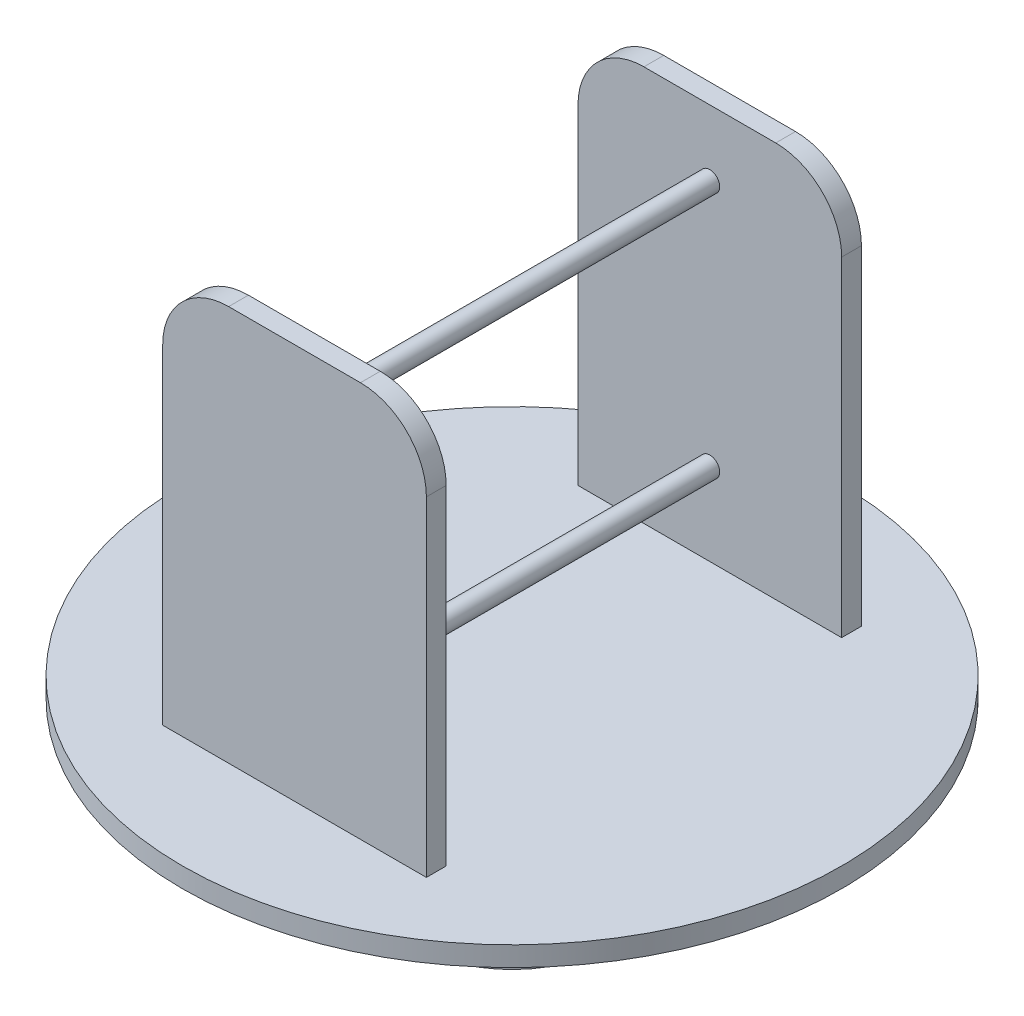
ISO-10303-21;
HEADER;
FILE_DESCRIPTION(('STEP AP214'),'2;1');
FILE_NAME('part.step','',(''),(''),'','','');
FILE_SCHEMA(('AUTOMOTIVE_DESIGN { 1 0 10303 214 1 1 1 1 }'));
ENDSEC;
DATA;
#1=APPLICATION_CONTEXT('core data for automotive mechanical design processes');
#2=APPLICATION_PROTOCOL_DEFINITION('international standard','automotive_design',2000,#1);
#3=PRODUCT_CONTEXT('',#1,'mechanical');
#4=PRODUCT('Part','Part','',(#3));
#5=PRODUCT_RELATED_PRODUCT_CATEGORY('part','',(#4));
#6=PRODUCT_DEFINITION_FORMATION('','',#4);
#7=PRODUCT_DEFINITION_CONTEXT('part definition',#1,'design');
#8=PRODUCT_DEFINITION('design','',#6,#7);
#9=PRODUCT_DEFINITION_SHAPE('','',#8);
#10=(LENGTH_UNIT() NAMED_UNIT(*) SI_UNIT(.MILLI.,.METRE.));
#11=(NAMED_UNIT(*) PLANE_ANGLE_UNIT() SI_UNIT($,.RADIAN.));
#12=(NAMED_UNIT(*) SI_UNIT($,.STERADIAN.) SOLID_ANGLE_UNIT());
#13=UNCERTAINTY_MEASURE_WITH_UNIT(LENGTH_MEASURE(1.E-05),#10,'distance_accuracy_value','');
#14=(GEOMETRIC_REPRESENTATION_CONTEXT(3) GLOBAL_UNCERTAINTY_ASSIGNED_CONTEXT((#13)) GLOBAL_UNIT_ASSIGNED_CONTEXT((#10,
#11,#12)) REPRESENTATION_CONTEXT('',''));
#15=CARTESIAN_POINT('',(0.,0.,0.));
#16=DIRECTION('',(0.,0.,1.));
#17=DIRECTION('',(1.,0.,0.));
#18=AXIS2_PLACEMENT_3D('',#15,#16,#17);
#19=CARTESIAN_POINT('',(0.,3.,0.));
#20=DIRECTION('',(0.,1.,0.));
#21=DIRECTION('',(0.,0.,1.));
#22=AXIS2_PLACEMENT_3D('',#19,#20,#21);
#23=PLANE('',#22);
#24=CARTESIAN_POINT('',(0.,3.,0.));
#25=DIRECTION('',(0.,1.,0.));
#26=DIRECTION('',(0.,0.,1.));
#27=AXIS2_PLACEMENT_3D('',#24,#25,#26);
#28=CIRCLE('',#27,50.);
#29=CARTESIAN_POINT('',(0.,3.,50.));
#30=VERTEX_POINT('',#29);
#31=EDGE_CURVE('E191',#30,#30,#28,.T.);
#32=ORIENTED_EDGE('',*,*,#31,.T.);
#33=EDGE_LOOP('',(#32));
#34=FACE_BOUND('',#33,.T.);
#35=DIRECTION('',(1.,0.,0.));
#36=VECTOR('',#35,1.);
#37=CARTESIAN_POINT('',(-20.,3.,33.));
#38=LINE('',#37,#36);
#39=CARTESIAN_POINT('',(-20.,3.,33.));
#40=VERTEX_POINT('',#39);
#41=CARTESIAN_POINT('',(20.,3.,33.));
#42=VERTEX_POINT('',#41);
#43=EDGE_CURVE('E168',#40,#42,#38,.T.);
#44=ORIENTED_EDGE('',*,*,#43,.F.);
#45=DIRECTION('',(0.,0.,1.));
#46=VECTOR('',#45,1.);
#47=CARTESIAN_POINT('',(-20.,3.,33.));
#48=LINE('',#47,#46);
#49=CARTESIAN_POINT('',(-20.,3.,30.));
#50=VERTEX_POINT('',#49);
#51=EDGE_CURVE('E132',#50,#40,#48,.T.);
#52=ORIENTED_EDGE('',*,*,#51,.F.);
#53=DIRECTION('',(-1.,0.,0.));
#54=VECTOR('',#53,1.);
#55=CARTESIAN_POINT('',(-20.,3.,30.));
#56=LINE('',#55,#54);
#57=CARTESIAN_POINT('',(20.,3.,30.));
#58=VERTEX_POINT('',#57);
#59=EDGE_CURVE('E162',#58,#50,#56,.T.);
#60=ORIENTED_EDGE('',*,*,#59,.F.);
#61=DIRECTION('',(0.,0.,-1.));
#62=VECTOR('',#61,1.);
#63=CARTESIAN_POINT('',(20.,3.,33.));
#64=LINE('',#63,#62);
#65=EDGE_CURVE('E171',#42,#58,#64,.T.);
#66=ORIENTED_EDGE('',*,*,#65,.F.);
#67=EDGE_LOOP('',(#44,#52,#60,#66));
#68=FACE_BOUND('',#67,.T.);
#69=DIRECTION('',(1.,0.,0.));
#70=VECTOR('',#69,1.);
#71=CARTESIAN_POINT('',(-20.,3.,-30.));
#72=LINE('',#71,#70);
#73=CARTESIAN_POINT('',(-20.,3.,-30.));
#74=VERTEX_POINT('',#73);
#75=CARTESIAN_POINT('',(20.,3.,-30.));
#76=VERTEX_POINT('',#75);
#77=EDGE_CURVE('E129',#74,#76,#72,.T.);
#78=ORIENTED_EDGE('',*,*,#77,.F.);
#79=DIRECTION('',(0.,0.,1.));
#80=VECTOR('',#79,1.);
#81=CARTESIAN_POINT('',(-20.,3.,-30.));
#82=LINE('',#81,#80);
#83=CARTESIAN_POINT('',(-20.,3.,-33.));
#84=VERTEX_POINT('',#83);
#85=EDGE_CURVE('E136',#84,#74,#82,.T.);
#86=ORIENTED_EDGE('',*,*,#85,.F.);
#87=DIRECTION('',(-1.,0.,0.));
#88=VECTOR('',#87,1.);
#89=CARTESIAN_POINT('',(-20.,3.,-33.));
#90=LINE('',#89,#88);
#91=CARTESIAN_POINT('',(20.,3.,-33.));
#92=VERTEX_POINT('',#91);
#93=EDGE_CURVE('E147',#92,#84,#90,.T.);
#94=ORIENTED_EDGE('',*,*,#93,.F.);
#95=DIRECTION('',(0.,0.,-1.));
#96=VECTOR('',#95,1.);
#97=CARTESIAN_POINT('',(20.,3.,-30.));
#98=LINE('',#97,#96);
#99=EDGE_CURVE('E145',#76,#92,#98,.T.);
#100=ORIENTED_EDGE('',*,*,#99,.F.);
#101=EDGE_LOOP('',(#78,#86,#94,#100));
#102=FACE_BOUND('',#101,.T.);
#103=ADVANCED_FACE('F35',(#34,#68,#102),#23,.T.);
#104=CARTESIAN_POINT('',(0.,3.,0.));
#105=DIRECTION('',(0.,-1.,0.));
#106=DIRECTION('',(0.,0.,-1.));
#107=AXIS2_PLACEMENT_3D('',#104,#105,#106);
#108=CYLINDRICAL_SURFACE('',#107,50.);
#109=ORIENTED_EDGE('',*,*,#31,.F.);
#110=EDGE_LOOP('',(#109));
#111=FACE_BOUND('',#110,.T.);
#112=CARTESIAN_POINT('',(0.,0.,0.));
#113=DIRECTION('',(0.,1.,0.));
#114=DIRECTION('',(0.,0.,1.));
#115=AXIS2_PLACEMENT_3D('',#112,#113,#114);
#116=CIRCLE('',#115,50.);
#117=CARTESIAN_POINT('',(0.,0.,50.));
#118=VERTEX_POINT('',#117);
#119=EDGE_CURVE('E186',#118,#118,#116,.T.);
#120=ORIENTED_EDGE('',*,*,#119,.T.);
#121=EDGE_LOOP('',(#120));
#122=FACE_BOUND('',#121,.T.);
#123=ADVANCED_FACE('F310',(#111,#122),#108,.T.);
#124=CARTESIAN_POINT('',(0.,0.,0.));
#125=DIRECTION('',(0.,1.,0.));
#126=DIRECTION('',(0.,0.,1.));
#127=AXIS2_PLACEMENT_3D('',#124,#125,#126);
#128=PLANE('',#127);
#129=CARTESIAN_POINT('',(0.,0.,0.));
#130=DIRECTION('',(0.,-1.,0.));
#131=DIRECTION('',(0.,0.,-1.));
#132=AXIS2_PLACEMENT_3D('',#129,#130,#131);
#133=CIRCLE('',#132,15.);
#134=CARTESIAN_POINT('',(0.,0.,-15.));
#135=VERTEX_POINT('',#134);
#136=EDGE_CURVE('E187',#135,#135,#133,.T.);
#137=ORIENTED_EDGE('',*,*,#136,.F.);
#138=EDGE_LOOP('',(#137));
#139=FACE_BOUND('',#138,.T.);
#140=ORIENTED_EDGE('',*,*,#119,.F.);
#141=EDGE_LOOP('',(#140));
#142=FACE_BOUND('',#141,.T.);
#143=ADVANCED_FACE('F316',(#139,#142),#128,.F.);
#144=CARTESIAN_POINT('',(0.,-25.,0.));
#145=DIRECTION('',(0.,1.,0.));
#146=DIRECTION('',(0.,0.,1.));
#147=AXIS2_PLACEMENT_3D('',#144,#145,#146);
#148=CYLINDRICAL_SURFACE('',#147,15.);
#149=CARTESIAN_POINT('',(0.,-25.,0.));
#150=DIRECTION('',(0.,-1.,0.));
#151=DIRECTION('',(0.,0.,-1.));
#152=AXIS2_PLACEMENT_3D('',#149,#150,#151);
#153=CIRCLE('',#152,15.);
#154=CARTESIAN_POINT('',(0.,-25.,-15.));
#155=VERTEX_POINT('',#154);
#156=EDGE_CURVE('E183',#155,#155,#153,.T.);
#157=ORIENTED_EDGE('',*,*,#156,.F.);
#158=EDGE_LOOP('',(#157));
#159=FACE_BOUND('',#158,.T.);
#160=ORIENTED_EDGE('',*,*,#136,.T.);
#161=EDGE_LOOP('',(#160));
#162=FACE_BOUND('',#161,.T.);
#163=ADVANCED_FACE('F306',(#159,#162),#148,.T.);
#164=CARTESIAN_POINT('',(0.,-25.,0.));
#165=DIRECTION('',(0.,-1.,0.));
#166=DIRECTION('',(0.,0.,-1.));
#167=AXIS2_PLACEMENT_3D('',#164,#165,#166);
#168=PLANE('',#167);
#169=ORIENTED_EDGE('',*,*,#156,.T.);
#170=EDGE_LOOP('',(#169));
#171=FACE_BOUND('',#170,.T.);
#172=ADVANCED_FACE('F299',(#171),#168,.T.);
#173=CARTESIAN_POINT('',(-20.,63.,33.));
#174=DIRECTION('',(1.,0.,0.));
#175=DIRECTION('',(0.,0.,-1.));
#176=AXIS2_PLACEMENT_3D('',#173,#174,#175);
#177=PLANE('',#176);
#178=DIRECTION('',(0.,-1.,0.));
#179=VECTOR('',#178,1.);
#180=CARTESIAN_POINT('',(-20.,63.,33.));
#181=LINE('',#180,#179);
#182=CARTESIAN_POINT('',(-20.,53.,33.));
#183=VERTEX_POINT('',#182);
#184=EDGE_CURVE('E181',#183,#40,#181,.T.);
#185=ORIENTED_EDGE('',*,*,#184,.F.);
#186=DIRECTION('',(0.,0.,1.));
#187=VECTOR('',#186,1.);
#188=CARTESIAN_POINT('',(-20.,53.,33.));
#189=LINE('',#188,#187);
#190=CARTESIAN_POINT('',(-20.,53.,30.));
#191=VERTEX_POINT('',#190);
#192=EDGE_CURVE('E205',#183,#191,#189,.F.);
#193=ORIENTED_EDGE('',*,*,#192,.T.);
#194=DIRECTION('',(0.,-1.,0.));
#195=VECTOR('',#194,1.);
#196=CARTESIAN_POINT('',(-20.,63.,30.));
#197=LINE('',#196,#195);
#198=EDGE_CURVE('E165',#191,#50,#197,.T.);
#199=ORIENTED_EDGE('',*,*,#198,.T.);
#200=ORIENTED_EDGE('',*,*,#51,.T.);
#201=EDGE_LOOP('',(#185,#193,#199,#200));
#202=FACE_BOUND('',#201,.T.);
#203=ADVANCED_FACE('F297',(#202),#177,.F.);
#204=CARTESIAN_POINT('',(-20.,63.,33.));
#205=DIRECTION('',(0.,0.,-1.));
#206=DIRECTION('',(-1.,0.,0.));
#207=AXIS2_PLACEMENT_3D('',#204,#205,#206);
#208=PLANE('',#207);
#209=DIRECTION('',(1.,0.,0.));
#210=VECTOR('',#209,1.);
#211=CARTESIAN_POINT('',(-20.,63.,33.));
#212=LINE('',#211,#210);
#213=CARTESIAN_POINT('',(-10.,63.,33.));
#214=VERTEX_POINT('',#213);
#215=CARTESIAN_POINT('',(10.,63.,33.));
#216=VERTEX_POINT('',#215);
#217=EDGE_CURVE('E158',#214,#216,#212,.T.);
#218=ORIENTED_EDGE('',*,*,#217,.F.);
#219=CARTESIAN_POINT('',(-10.,53.,33.));
#220=DIRECTION('',(0.,0.,-1.));
#221=DIRECTION('',(-1.,0.,0.));
#222=AXIS2_PLACEMENT_3D('',#219,#220,#221);
#223=CIRCLE('',#222,10.);
#224=EDGE_CURVE('E203',#214,#183,#223,.F.);
#225=ORIENTED_EDGE('',*,*,#224,.T.);
#226=ORIENTED_EDGE('',*,*,#184,.T.);
#227=ORIENTED_EDGE('',*,*,#43,.T.);
#228=DIRECTION('',(0.,-1.,0.));
#229=VECTOR('',#228,1.);
#230=CARTESIAN_POINT('',(20.,63.,33.));
#231=LINE('',#230,#229);
#232=CARTESIAN_POINT('',(20.,53.,33.));
#233=VERTEX_POINT('',#232);
#234=EDGE_CURVE('E179',#233,#42,#231,.T.);
#235=ORIENTED_EDGE('',*,*,#234,.F.);
#236=CARTESIAN_POINT('',(10.,53.,33.));
#237=DIRECTION('',(0.,0.,-1.));
#238=DIRECTION('',(-1.,0.,0.));
#239=AXIS2_PLACEMENT_3D('',#236,#237,#238);
#240=CIRCLE('',#239,10.);
#241=EDGE_CURVE('E201',#233,#216,#240,.F.);
#242=ORIENTED_EDGE('',*,*,#241,.T.);
#243=EDGE_LOOP('',(#218,#225,#226,#227,#235,#242));
#244=FACE_BOUND('',#243,.T.);
#245=ADVANCED_FACE('F286',(#244),#208,.F.);
#246=CARTESIAN_POINT('',(20.,63.,33.));
#247=DIRECTION('',(-1.,0.,0.));
#248=DIRECTION('',(0.,0.,1.));
#249=AXIS2_PLACEMENT_3D('',#246,#247,#248);
#250=PLANE('',#249);
#251=DIRECTION('',(0.,-1.,0.));
#252=VECTOR('',#251,1.);
#253=CARTESIAN_POINT('',(20.,63.,30.));
#254=LINE('',#253,#252);
#255=CARTESIAN_POINT('',(20.,53.,30.));
#256=VERTEX_POINT('',#255);
#257=EDGE_CURVE('E177',#256,#58,#254,.T.);
#258=ORIENTED_EDGE('',*,*,#257,.F.);
#259=DIRECTION('',(0.,0.,-1.));
#260=VECTOR('',#259,1.);
#261=CARTESIAN_POINT('',(20.,53.,33.));
#262=LINE('',#261,#260);
#263=EDGE_CURVE('E11',#256,#233,#262,.F.);
#264=ORIENTED_EDGE('',*,*,#263,.T.);
#265=ORIENTED_EDGE('',*,*,#234,.T.);
#266=ORIENTED_EDGE('',*,*,#65,.T.);
#267=EDGE_LOOP('',(#258,#264,#265,#266));
#268=FACE_BOUND('',#267,.T.);
#269=ADVANCED_FACE('F269',(#268),#250,.F.);
#270=CARTESIAN_POINT('',(-20.,63.,30.));
#271=DIRECTION('',(0.,0.,1.));
#272=DIRECTION('',(1.,0.,0.));
#273=AXIS2_PLACEMENT_3D('',#270,#271,#272);
#274=PLANE('',#273);
#275=CARTESIAN_POINT('',(0.,15.5,30.));
#276=DIRECTION('',(0.,0.,1.));
#277=DIRECTION('',(1.,0.,0.));
#278=AXIS2_PLACEMENT_3D('',#275,#276,#277);
#279=CIRCLE('',#278,1.5);
#280=CARTESIAN_POINT('',(1.5,15.5,30.));
#281=VERTEX_POINT('',#280);
#282=EDGE_CURVE('E244',#281,#281,#279,.T.);
#283=ORIENTED_EDGE('',*,*,#282,.T.);
#284=EDGE_LOOP('',(#283));
#285=FACE_BOUND('',#284,.T.);
#286=CARTESIAN_POINT('',(0.,53.,30.));
#287=DIRECTION('',(0.,0.,1.));
#288=DIRECTION('',(1.,0.,0.));
#289=AXIS2_PLACEMENT_3D('',#286,#287,#288);
#290=CIRCLE('',#289,1.5);
#291=CARTESIAN_POINT('',(1.5,53.,30.));
#292=VERTEX_POINT('',#291);
#293=EDGE_CURVE('E142',#292,#292,#290,.T.);
#294=ORIENTED_EDGE('',*,*,#293,.T.);
#295=EDGE_LOOP('',(#294));
#296=FACE_BOUND('',#295,.T.);
#297=ORIENTED_EDGE('',*,*,#198,.F.);
#298=CARTESIAN_POINT('',(-10.,53.,30.));
#299=DIRECTION('',(0.,0.,1.));
#300=DIRECTION('',(1.,0.,0.));
#301=AXIS2_PLACEMENT_3D('',#298,#299,#300);
#302=CIRCLE('',#301,10.);
#303=CARTESIAN_POINT('',(-10.,63.,30.));
#304=VERTEX_POINT('',#303);
#305=EDGE_CURVE('E209',#191,#304,#302,.F.);
#306=ORIENTED_EDGE('',*,*,#305,.T.);
#307=DIRECTION('',(-1.,0.,0.));
#308=VECTOR('',#307,1.);
#309=CARTESIAN_POINT('',(-20.,63.,30.));
#310=LINE('',#309,#308);
#311=CARTESIAN_POINT('',(10.,63.,30.));
#312=VERTEX_POINT('',#311);
#313=EDGE_CURVE('E161',#312,#304,#310,.T.);
#314=ORIENTED_EDGE('',*,*,#313,.F.);
#315=CARTESIAN_POINT('',(10.,53.,30.));
#316=DIRECTION('',(0.,0.,1.));
#317=DIRECTION('',(1.,0.,0.));
#318=AXIS2_PLACEMENT_3D('',#315,#316,#317);
#319=CIRCLE('',#318,10.);
#320=EDGE_CURVE('E207',#312,#256,#319,.F.);
#321=ORIENTED_EDGE('',*,*,#320,.T.);
#322=ORIENTED_EDGE('',*,*,#257,.T.);
#323=ORIENTED_EDGE('',*,*,#59,.T.);
#324=EDGE_LOOP('',(#297,#306,#314,#321,#322,#323));
#325=FACE_BOUND('',#324,.T.);
#326=ADVANCED_FACE('F265',(#285,#296,#325),#274,.F.);
#327=CARTESIAN_POINT('',(0.,63.,0.));
#328=DIRECTION('',(0.,-1.,0.));
#329=DIRECTION('',(0.,0.,-1.));
#330=AXIS2_PLACEMENT_3D('',#327,#328,#329);
#331=PLANE('',#330);
#332=ORIENTED_EDGE('',*,*,#313,.T.);
#333=DIRECTION('',(0.,0.,1.));
#334=VECTOR('',#333,1.);
#335=CARTESIAN_POINT('',(-10.,63.,0.));
#336=LINE('',#335,#334);
#337=EDGE_CURVE('E198',#304,#214,#336,.T.);
#338=ORIENTED_EDGE('',*,*,#337,.T.);
#339=ORIENTED_EDGE('',*,*,#217,.T.);
#340=DIRECTION('',(0.,0.,-1.));
#341=VECTOR('',#340,1.);
#342=CARTESIAN_POINT('',(10.,63.,0.));
#343=LINE('',#342,#341);
#344=EDGE_CURVE('E190',#216,#312,#343,.T.);
#345=ORIENTED_EDGE('',*,*,#344,.T.);
#346=EDGE_LOOP('',(#332,#338,#339,#345));
#347=FACE_BOUND('',#346,.T.);
#348=ADVANCED_FACE('F268',(#347),#331,.F.);
#349=CARTESIAN_POINT('',(-20.,63.,-30.));
#350=DIRECTION('',(1.,0.,0.));
#351=DIRECTION('',(0.,0.,-1.));
#352=AXIS2_PLACEMENT_3D('',#349,#350,#351);
#353=PLANE('',#352);
#354=DIRECTION('',(0.,-1.,0.));
#355=VECTOR('',#354,1.);
#356=CARTESIAN_POINT('',(-20.,63.,-30.));
#357=LINE('',#356,#355);
#358=CARTESIAN_POINT('',(-20.,53.,-30.));
#359=VERTEX_POINT('',#358);
#360=EDGE_CURVE('E123',#359,#74,#357,.T.);
#361=ORIENTED_EDGE('',*,*,#360,.F.);
#362=DIRECTION('',(0.,0.,1.));
#363=VECTOR('',#362,1.);
#364=CARTESIAN_POINT('',(-20.,53.,-30.));
#365=LINE('',#364,#363);
#366=CARTESIAN_POINT('',(-20.,53.,-33.));
#367=VERTEX_POINT('',#366);
#368=EDGE_CURVE('E58',#359,#367,#365,.F.);
#369=ORIENTED_EDGE('',*,*,#368,.T.);
#370=DIRECTION('',(0.,-1.,0.));
#371=VECTOR('',#370,1.);
#372=CARTESIAN_POINT('',(-20.,63.,-33.));
#373=LINE('',#372,#371);
#374=EDGE_CURVE('E138',#367,#84,#373,.T.);
#375=ORIENTED_EDGE('',*,*,#374,.T.);
#376=ORIENTED_EDGE('',*,*,#85,.T.);
#377=EDGE_LOOP('',(#361,#369,#375,#376));
#378=FACE_BOUND('',#377,.T.);
#379=ADVANCED_FACE('F137',(#378),#353,.F.);
#380=CARTESIAN_POINT('',(-20.,63.,-30.));
#381=DIRECTION('',(0.,0.,-1.));
#382=DIRECTION('',(-1.,0.,0.));
#383=AXIS2_PLACEMENT_3D('',#380,#381,#382);
#384=PLANE('',#383);
#385=CARTESIAN_POINT('',(0.,15.5,-30.));
#386=DIRECTION('',(0.,0.,-1.));
#387=DIRECTION('',(-1.,0.,0.));
#388=AXIS2_PLACEMENT_3D('',#385,#386,#387);
#389=CIRCLE('',#388,1.5);
#390=CARTESIAN_POINT('',(-1.5,15.5,-30.));
#391=VERTEX_POINT('',#390);
#392=EDGE_CURVE('E247',#391,#391,#389,.F.);
#393=ORIENTED_EDGE('',*,*,#392,.F.);
#394=EDGE_LOOP('',(#393));
#395=FACE_BOUND('',#394,.T.);
#396=CARTESIAN_POINT('',(0.,53.,-30.));
#397=DIRECTION('',(0.,0.,-1.));
#398=DIRECTION('',(-1.,0.,0.));
#399=AXIS2_PLACEMENT_3D('',#396,#397,#398);
#400=CIRCLE('',#399,1.5);
#401=CARTESIAN_POINT('',(-1.5,53.,-30.));
#402=VERTEX_POINT('',#401);
#403=EDGE_CURVE('E241',#402,#402,#400,.F.);
#404=ORIENTED_EDGE('',*,*,#403,.F.);
#405=EDGE_LOOP('',(#404));
#406=FACE_BOUND('',#405,.T.);
#407=DIRECTION('',(1.,0.,0.));
#408=VECTOR('',#407,1.);
#409=CARTESIAN_POINT('',(-20.,63.,-30.));
#410=LINE('',#409,#408);
#411=CARTESIAN_POINT('',(-10.,63.,-30.));
#412=VERTEX_POINT('',#411);
#413=CARTESIAN_POINT('',(10.,63.,-30.));
#414=VERTEX_POINT('',#413);
#415=EDGE_CURVE('E152',#412,#414,#410,.T.);
#416=ORIENTED_EDGE('',*,*,#415,.F.);
#417=CARTESIAN_POINT('',(-10.,53.,-30.));
#418=DIRECTION('',(0.,0.,-1.));
#419=DIRECTION('',(-1.,0.,0.));
#420=AXIS2_PLACEMENT_3D('',#417,#418,#419);
#421=CIRCLE('',#420,10.);
#422=EDGE_CURVE('E131',#412,#359,#421,.F.);
#423=ORIENTED_EDGE('',*,*,#422,.T.);
#424=ORIENTED_EDGE('',*,*,#360,.T.);
#425=ORIENTED_EDGE('',*,*,#77,.T.);
#426=DIRECTION('',(0.,-1.,0.));
#427=VECTOR('',#426,1.);
#428=CARTESIAN_POINT('',(20.,63.,-30.));
#429=LINE('',#428,#427);
#430=CARTESIAN_POINT('',(20.,53.,-30.));
#431=VERTEX_POINT('',#430);
#432=EDGE_CURVE('E133',#431,#76,#429,.T.);
#433=ORIENTED_EDGE('',*,*,#432,.F.);
#434=CARTESIAN_POINT('',(10.,53.,-30.));
#435=DIRECTION('',(0.,0.,-1.));
#436=DIRECTION('',(-1.,0.,0.));
#437=AXIS2_PLACEMENT_3D('',#434,#435,#436);
#438=CIRCLE('',#437,10.);
#439=EDGE_CURVE('E217',#431,#414,#438,.F.);
#440=ORIENTED_EDGE('',*,*,#439,.T.);
#441=EDGE_LOOP('',(#416,#423,#424,#425,#433,#440));
#442=FACE_BOUND('',#441,.T.);
#443=ADVANCED_FACE('F126',(#395,#406,#442),#384,.F.);
#444=CARTESIAN_POINT('',(20.,63.,-30.));
#445=DIRECTION('',(-1.,0.,0.));
#446=DIRECTION('',(0.,0.,1.));
#447=AXIS2_PLACEMENT_3D('',#444,#445,#446);
#448=PLANE('',#447);
#449=DIRECTION('',(0.,-1.,0.));
#450=VECTOR('',#449,1.);
#451=CARTESIAN_POINT('',(20.,63.,-33.));
#452=LINE('',#451,#450);
#453=CARTESIAN_POINT('',(20.,53.,-33.));
#454=VERTEX_POINT('',#453);
#455=EDGE_CURVE('E154',#454,#92,#452,.T.);
#456=ORIENTED_EDGE('',*,*,#455,.F.);
#457=DIRECTION('',(0.,0.,-1.));
#458=VECTOR('',#457,1.);
#459=CARTESIAN_POINT('',(20.,53.,-30.));
#460=LINE('',#459,#458);
#461=EDGE_CURVE('E43',#454,#431,#460,.F.);
#462=ORIENTED_EDGE('',*,*,#461,.T.);
#463=ORIENTED_EDGE('',*,*,#432,.T.);
#464=ORIENTED_EDGE('',*,*,#99,.T.);
#465=EDGE_LOOP('',(#456,#462,#463,#464));
#466=FACE_BOUND('',#465,.T.);
#467=ADVANCED_FACE('F225',(#466),#448,.F.);
#468=CARTESIAN_POINT('',(-20.,63.,-33.));
#469=DIRECTION('',(0.,0.,1.));
#470=DIRECTION('',(1.,0.,0.));
#471=AXIS2_PLACEMENT_3D('',#468,#469,#470);
#472=PLANE('',#471);
#473=ORIENTED_EDGE('',*,*,#374,.F.);
#474=CARTESIAN_POINT('',(-10.,53.,-33.));
#475=DIRECTION('',(0.,0.,1.));
#476=DIRECTION('',(1.,0.,0.));
#477=AXIS2_PLACEMENT_3D('',#474,#475,#476);
#478=CIRCLE('',#477,10.);
#479=CARTESIAN_POINT('',(-10.,63.,-33.));
#480=VERTEX_POINT('',#479);
#481=EDGE_CURVE('E222',#367,#480,#478,.F.);
#482=ORIENTED_EDGE('',*,*,#481,.T.);
#483=DIRECTION('',(-1.,0.,0.));
#484=VECTOR('',#483,1.);
#485=CARTESIAN_POINT('',(-20.,63.,-33.));
#486=LINE('',#485,#484);
#487=CARTESIAN_POINT('',(10.,63.,-33.));
#488=VERTEX_POINT('',#487);
#489=EDGE_CURVE('E155',#488,#480,#486,.T.);
#490=ORIENTED_EDGE('',*,*,#489,.F.);
#491=CARTESIAN_POINT('',(10.,53.,-33.));
#492=DIRECTION('',(0.,0.,1.));
#493=DIRECTION('',(1.,0.,0.));
#494=AXIS2_PLACEMENT_3D('',#491,#492,#493);
#495=CIRCLE('',#494,10.);
#496=EDGE_CURVE('E50',#488,#454,#495,.F.);
#497=ORIENTED_EDGE('',*,*,#496,.T.);
#498=ORIENTED_EDGE('',*,*,#455,.T.);
#499=ORIENTED_EDGE('',*,*,#93,.T.);
#500=EDGE_LOOP('',(#473,#482,#490,#497,#498,#499));
#501=FACE_BOUND('',#500,.T.);
#502=ADVANCED_FACE('F235',(#501),#472,.F.);
#503=CARTESIAN_POINT('',(0.,63.,0.));
#504=DIRECTION('',(0.,-1.,0.));
#505=DIRECTION('',(0.,0.,-1.));
#506=AXIS2_PLACEMENT_3D('',#503,#504,#505);
#507=PLANE('',#506);
#508=ORIENTED_EDGE('',*,*,#489,.T.);
#509=DIRECTION('',(0.,0.,1.));
#510=VECTOR('',#509,1.);
#511=CARTESIAN_POINT('',(-10.,63.,0.));
#512=LINE('',#511,#510);
#513=EDGE_CURVE('E214',#480,#412,#512,.T.);
#514=ORIENTED_EDGE('',*,*,#513,.T.);
#515=ORIENTED_EDGE('',*,*,#415,.T.);
#516=DIRECTION('',(0.,0.,-1.));
#517=VECTOR('',#516,1.);
#518=CARTESIAN_POINT('',(10.,63.,0.));
#519=LINE('',#518,#517);
#520=EDGE_CURVE('E211',#414,#488,#519,.T.);
#521=ORIENTED_EDGE('',*,*,#520,.T.);
#522=EDGE_LOOP('',(#508,#514,#515,#521));
#523=FACE_BOUND('',#522,.T.);
#524=ADVANCED_FACE('F233',(#523),#507,.F.);
#525=CARTESIAN_POINT('',(0.,53.,-34.2426406871193));
#526=DIRECTION('',(0.,0.,1.));
#527=DIRECTION('',(1.,0.,0.));
#528=AXIS2_PLACEMENT_3D('',#525,#526,#527);
#529=CYLINDRICAL_SURFACE('',#528,1.5);
#530=ORIENTED_EDGE('',*,*,#403,.T.);
#531=EDGE_LOOP('',(#530));
#532=FACE_BOUND('',#531,.T.);
#533=ORIENTED_EDGE('',*,*,#293,.F.);
#534=EDGE_LOOP('',(#533));
#535=FACE_BOUND('',#534,.T.);
#536=ADVANCED_FACE('F259',(#532,#535),#529,.T.);
#537=CARTESIAN_POINT('',(0.,15.5,-34.2426406871193));
#538=DIRECTION('',(0.,0.,1.));
#539=DIRECTION('',(1.,0.,0.));
#540=AXIS2_PLACEMENT_3D('',#537,#538,#539);
#541=CYLINDRICAL_SURFACE('',#540,1.5);
#542=ORIENTED_EDGE('',*,*,#392,.T.);
#543=EDGE_LOOP('',(#542));
#544=FACE_BOUND('',#543,.T.);
#545=ORIENTED_EDGE('',*,*,#282,.F.);
#546=EDGE_LOOP('',(#545));
#547=FACE_BOUND('',#546,.T.);
#548=ADVANCED_FACE('F251',(#544,#547),#541,.T.);
#549=CARTESIAN_POINT('',(-10.,53.,0.));
#550=DIRECTION('',(0.,0.,1.));
#551=DIRECTION('',(1.,0.,0.));
#552=AXIS2_PLACEMENT_3D('',#549,#550,#551);
#553=CYLINDRICAL_SURFACE('',#552,10.);
#554=ORIENTED_EDGE('',*,*,#305,.F.);
#555=ORIENTED_EDGE('',*,*,#192,.F.);
#556=ORIENTED_EDGE('',*,*,#224,.F.);
#557=ORIENTED_EDGE('',*,*,#337,.F.);
#558=EDGE_LOOP('',(#554,#555,#556,#557));
#559=FACE_BOUND('',#558,.T.);
#560=ADVANCED_FACE('F281',(#559),#553,.T.);
#561=CARTESIAN_POINT('',(-10.,53.,0.));
#562=DIRECTION('',(0.,0.,1.));
#563=DIRECTION('',(1.,0.,0.));
#564=AXIS2_PLACEMENT_3D('',#561,#562,#563);
#565=CYLINDRICAL_SURFACE('',#564,10.);
#566=ORIENTED_EDGE('',*,*,#481,.F.);
#567=ORIENTED_EDGE('',*,*,#368,.F.);
#568=ORIENTED_EDGE('',*,*,#422,.F.);
#569=ORIENTED_EDGE('',*,*,#513,.F.);
#570=EDGE_LOOP('',(#566,#567,#568,#569));
#571=FACE_BOUND('',#570,.T.);
#572=ADVANCED_FACE('F326',(#571),#565,.T.);
#573=CARTESIAN_POINT('',(10.,53.,0.));
#574=DIRECTION('',(0.,0.,-1.));
#575=DIRECTION('',(-1.,0.,0.));
#576=AXIS2_PLACEMENT_3D('',#573,#574,#575);
#577=CYLINDRICAL_SURFACE('',#576,10.);
#578=ORIENTED_EDGE('',*,*,#439,.F.);
#579=ORIENTED_EDGE('',*,*,#461,.F.);
#580=ORIENTED_EDGE('',*,*,#496,.F.);
#581=ORIENTED_EDGE('',*,*,#520,.F.);
#582=EDGE_LOOP('',(#578,#579,#580,#581));
#583=FACE_BOUND('',#582,.T.);
#584=ADVANCED_FACE('F230',(#583),#577,.T.);
#585=CARTESIAN_POINT('',(10.,53.,0.));
#586=DIRECTION('',(0.,0.,-1.));
#587=DIRECTION('',(-1.,0.,0.));
#588=AXIS2_PLACEMENT_3D('',#585,#586,#587);
#589=CYLINDRICAL_SURFACE('',#588,10.);
#590=ORIENTED_EDGE('',*,*,#241,.F.);
#591=ORIENTED_EDGE('',*,*,#263,.F.);
#592=ORIENTED_EDGE('',*,*,#320,.F.);
#593=ORIENTED_EDGE('',*,*,#344,.F.);
#594=EDGE_LOOP('',(#590,#591,#592,#593));
#595=FACE_BOUND('',#594,.T.);
#596=ADVANCED_FACE('F37',(#595),#589,.T.);
#597=CLOSED_SHELL('',(#103,#123,#143,#163,#172,#203,#245,#269,#326,#348,#379,#443,#467,#502,
#524,#536,#548,#560,#572,#584,#596));
#598=MANIFOLD_SOLID_BREP('B2',#597);
#599=ADVANCED_BREP_SHAPE_REPRESENTATION('',(#18,#598),#14);
#600=SHAPE_DEFINITION_REPRESENTATION(#9,#599);
ENDSEC;
END-ISO-10303-21;
